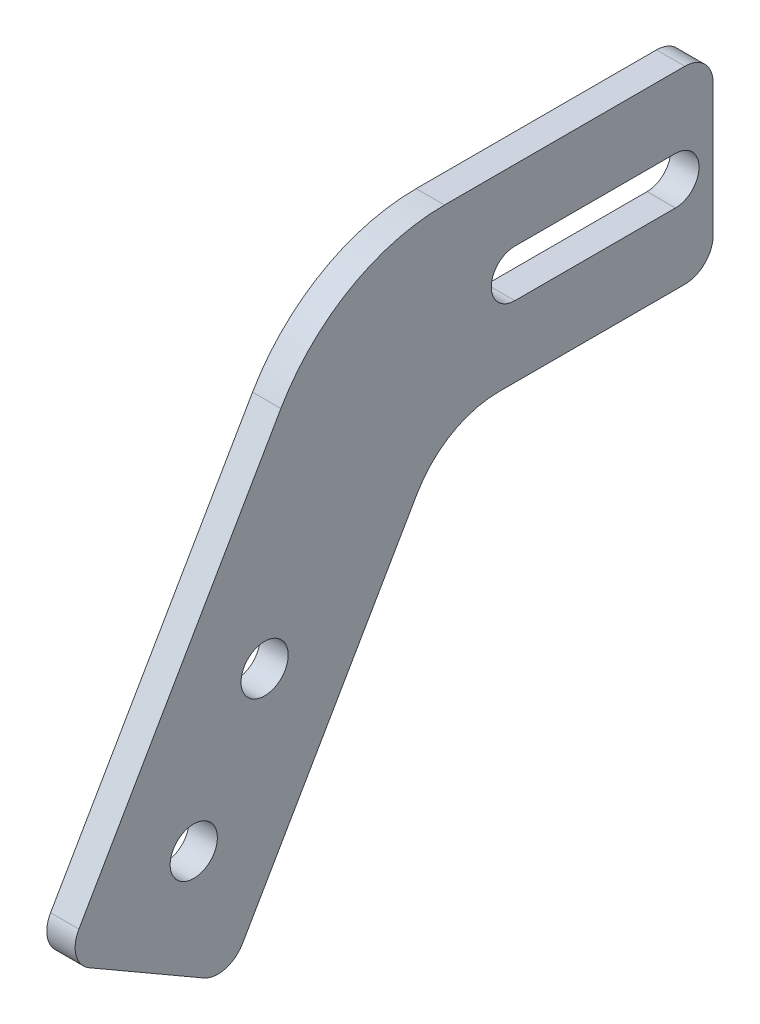
ISO-10303-21;
HEADER;
FILE_DESCRIPTION(('STEP AP214'),'2;1');
FILE_NAME('part.step','',(''),(''),'','','');
FILE_SCHEMA(('AUTOMOTIVE_DESIGN { 1 0 10303 214 1 1 1 1 }'));
ENDSEC;
DATA;
#1=APPLICATION_CONTEXT('core data for automotive mechanical design processes');
#2=APPLICATION_PROTOCOL_DEFINITION('international standard','automotive_design',2000,#1);
#3=PRODUCT_CONTEXT('',#1,'mechanical');
#4=PRODUCT('Part','Part','',(#3));
#5=PRODUCT_RELATED_PRODUCT_CATEGORY('part','',(#4));
#6=PRODUCT_DEFINITION_FORMATION('','',#4);
#7=PRODUCT_DEFINITION_CONTEXT('part definition',#1,'design');
#8=PRODUCT_DEFINITION('design','',#6,#7);
#9=PRODUCT_DEFINITION_SHAPE('','',#8);
#10=(LENGTH_UNIT() NAMED_UNIT(*) SI_UNIT(.MILLI.,.METRE.));
#11=(NAMED_UNIT(*) PLANE_ANGLE_UNIT() SI_UNIT($,.RADIAN.));
#12=(NAMED_UNIT(*) SI_UNIT($,.STERADIAN.) SOLID_ANGLE_UNIT());
#13=UNCERTAINTY_MEASURE_WITH_UNIT(LENGTH_MEASURE(1.E-05),#10,'distance_accuracy_value','');
#14=(GEOMETRIC_REPRESENTATION_CONTEXT(3) GLOBAL_UNCERTAINTY_ASSIGNED_CONTEXT((#13)) GLOBAL_UNIT_ASSIGNED_CONTEXT((#10,
#11,#12)) REPRESENTATION_CONTEXT('',''));
#15=CARTESIAN_POINT('',(0.,0.,0.));
#16=DIRECTION('',(0.,0.,1.));
#17=DIRECTION('',(1.,0.,0.));
#18=AXIS2_PLACEMENT_3D('',#15,#16,#17);
#19=CARTESIAN_POINT('',(3.,0.,-11.5470053837925));
#20=DIRECTION('',(-1.,0.,0.));
#21=DIRECTION('',(0.,0.,1.));
#22=AXIS2_PLACEMENT_3D('',#19,#20,#21);
#23=PLANE('',#22);
#24=CARTESIAN_POINT('',(3.,-12.9903810567665,7.50000000000006));
#25=DIRECTION('',(1.,0.,0.));
#26=DIRECTION('',(0.,0.,-1.));
#27=AXIS2_PLACEMENT_3D('',#24,#25,#26);
#28=CIRCLE('',#27,2.5);
#29=CARTESIAN_POINT('',(3.,-12.9903810567665,5.00000000000006));
#30=VERTEX_POINT('',#29);
#31=EDGE_CURVE('E209',#30,#30,#28,.T.);
#32=ORIENTED_EDGE('',*,*,#31,.F.);
#33=EDGE_LOOP('',(#32));
#34=FACE_BOUND('',#33,.T.);
#35=CARTESIAN_POINT('',(3.,-25.9807621135331,15.0000000000001));
#36=DIRECTION('',(1.,0.,0.));
#37=DIRECTION('',(0.,0.,-1.));
#38=AXIS2_PLACEMENT_3D('',#35,#36,#37);
#39=CIRCLE('',#38,2.5);
#40=CARTESIAN_POINT('',(3.,-25.9807621135331,12.5000000000001));
#41=VERTEX_POINT('',#40);
#42=EDGE_CURVE('E217',#41,#41,#39,.T.);
#43=ORIENTED_EDGE('',*,*,#42,.F.);
#44=EDGE_LOOP('',(#43));
#45=FACE_BOUND('',#44,.T.);
#46=DIRECTION('',(0.,-0.866025403784436,0.500000000000004));
#47=VECTOR('',#46,1.);
#48=CARTESIAN_POINT('',(3.,10.,5.77350269189623));
#49=LINE('',#48,#47);
#50=CARTESIAN_POINT('',(3.,10.,5.77350269189623));
#51=VERTEX_POINT('',#50);
#52=CARTESIAN_POINT('',(3.,-27.0429399400241,27.1602540378445));
#53=VERTEX_POINT('',#52);
#54=EDGE_CURVE('E236',#51,#53,#49,.T.);
#55=ORIENTED_EDGE('',*,*,#54,.T.);
#56=CARTESIAN_POINT('',(3.,-28.5429399400241,24.5621778264912));
#57=DIRECTION('',(-1.,0.,0.));
#58=DIRECTION('',(0.,0.,1.));
#59=AXIS2_PLACEMENT_3D('',#56,#57,#58);
#60=CIRCLE('',#59,3.);
#61=CARTESIAN_POINT('',(3.,-31.1410161513774,26.0621778264912));
#62=VERTEX_POINT('',#61);
#63=EDGE_CURVE('E323',#53,#62,#60,.F.);
#64=ORIENTED_EDGE('',*,*,#63,.T.);
#65=DIRECTION('',(0.,-0.500000000000004,-0.866025403784436));
#66=VECTOR('',#65,1.);
#67=CARTESIAN_POINT('',(3.,-29.6410161513774,28.6602540378445));
#68=LINE('',#67,#66);
#69=CARTESIAN_POINT('',(3.,-38.1410161513775,13.9378221735091));
#70=VERTEX_POINT('',#69);
#71=EDGE_CURVE('E240',#62,#70,#68,.T.);
#72=ORIENTED_EDGE('',*,*,#71,.T.);
#73=CARTESIAN_POINT('',(3.,-35.5429399400242,12.4378221735091));
#74=DIRECTION('',(-1.,0.,0.));
#75=DIRECTION('',(0.,0.,1.));
#76=AXIS2_PLACEMENT_3D('',#73,#74,#75);
#77=CIRCLE('',#76,3.);
#78=CARTESIAN_POINT('',(3.,-37.0429399400242,9.83974596215579));
#79=VERTEX_POINT('',#78);
#80=EDGE_CURVE('E62',#70,#79,#77,.F.);
#81=ORIENTED_EDGE('',*,*,#80,.T.);
#82=DIRECTION('',(0.,0.866025403784436,-0.500000000000004));
#83=VECTOR('',#82,1.);
#84=CARTESIAN_POINT('',(3.,-5.,-8.66025403784439));
#85=LINE('',#84,#83);
#86=CARTESIAN_POINT('',(3.,-5.,-8.66025403784439));
#87=VERTEX_POINT('',#86);
#88=EDGE_CURVE('E243',#79,#87,#85,.T.);
#89=ORIENTED_EDGE('',*,*,#88,.T.);
#90=CARTESIAN_POINT('',(3.,-10.,-17.3205080756888));
#91=DIRECTION('',(-1.,0.,0.));
#92=DIRECTION('',(0.,0.,1.));
#93=AXIS2_PLACEMENT_3D('',#90,#91,#92);
#94=CIRCLE('',#93,10.);
#95=CARTESIAN_POINT('',(3.,0.,-17.3205080756888));
#96=VERTEX_POINT('',#95);
#97=EDGE_CURVE('E246',#87,#96,#94,.T.);
#98=ORIENTED_EDGE('',*,*,#97,.T.);
#99=DIRECTION('',(0.,0.,-1.));
#100=VECTOR('',#99,1.);
#101=CARTESIAN_POINT('',(3.,0.,-17.3205080756888));
#102=LINE('',#101,#100);
#103=CARTESIAN_POINT('',(3.,0.,-37.0000000000001));
#104=VERTEX_POINT('',#103);
#105=EDGE_CURVE('E249',#96,#104,#102,.T.);
#106=ORIENTED_EDGE('',*,*,#105,.T.);
#107=CARTESIAN_POINT('',(3.,3.,-37.0000000000001));
#108=DIRECTION('',(-1.,0.,0.));
#109=DIRECTION('',(0.,0.,1.));
#110=AXIS2_PLACEMENT_3D('',#107,#108,#109);
#111=CIRCLE('',#110,3.);
#112=CARTESIAN_POINT('',(3.,3.,-40.0000000000001));
#113=VERTEX_POINT('',#112);
#114=EDGE_CURVE('E318',#104,#113,#111,.F.);
#115=ORIENTED_EDGE('',*,*,#114,.T.);
#116=DIRECTION('',(0.,1.,0.));
#117=VECTOR('',#116,1.);
#118=CARTESIAN_POINT('',(3.,0.,-40.0000000000001));
#119=LINE('',#118,#117);
#120=CARTESIAN_POINT('',(3.,17.,-40.0000000000001));
#121=VERTEX_POINT('',#120);
#122=EDGE_CURVE('E225',#113,#121,#119,.T.);
#123=ORIENTED_EDGE('',*,*,#122,.T.);
#124=CARTESIAN_POINT('',(3.,17.,-37.0000000000001));
#125=DIRECTION('',(-1.,0.,0.));
#126=DIRECTION('',(0.,0.,1.));
#127=AXIS2_PLACEMENT_3D('',#124,#125,#126);
#128=CIRCLE('',#127,3.);
#129=CARTESIAN_POINT('',(3.,20.,-37.0000000000001));
#130=VERTEX_POINT('',#129);
#131=EDGE_CURVE('E315',#121,#130,#128,.F.);
#132=ORIENTED_EDGE('',*,*,#131,.T.);
#133=DIRECTION('',(0.,0.,1.));
#134=VECTOR('',#133,1.);
#135=CARTESIAN_POINT('',(3.,20.,-40.0000000000001));
#136=LINE('',#135,#134);
#137=CARTESIAN_POINT('',(3.,20.,-11.5470053837926));
#138=VERTEX_POINT('',#137);
#139=EDGE_CURVE('E229',#130,#138,#136,.T.);
#140=ORIENTED_EDGE('',*,*,#139,.T.);
#141=CARTESIAN_POINT('',(3.,0.,-11.5470053837925));
#142=DIRECTION('',(1.,0.,0.));
#143=DIRECTION('',(0.,0.,1.));
#144=AXIS2_PLACEMENT_3D('',#141,#142,#143);
#145=CIRCLE('',#144,20.);
#146=EDGE_CURVE('E233',#138,#51,#145,.T.);
#147=ORIENTED_EDGE('',*,*,#146,.T.);
#148=EDGE_LOOP('',(#55,#64,#72,#81,#89,#98,#106,#115,#123,#132,#140,#147));
#149=FACE_BOUND('',#148,.T.);
#150=CARTESIAN_POINT('',(3.,10.,-19.0000000000001));
#151=DIRECTION('',(1.,0.,0.));
#152=DIRECTION('',(0.,0.,-1.));
#153=AXIS2_PLACEMENT_3D('',#150,#151,#152);
#154=CIRCLE('',#153,2.5);
#155=CARTESIAN_POINT('',(3.,12.5,-19.0000000000001));
#156=VERTEX_POINT('',#155);
#157=CARTESIAN_POINT('',(3.,7.5,-19.0000000000001));
#158=VERTEX_POINT('',#157);
#159=EDGE_CURVE('E156',#156,#158,#154,.T.);
#160=ORIENTED_EDGE('',*,*,#159,.F.);
#161=DIRECTION('',(0.,0.,1.));
#162=VECTOR('',#161,1.);
#163=CARTESIAN_POINT('',(3.,12.5,-19.0000000000001));
#164=LINE('',#163,#162);
#165=CARTESIAN_POINT('',(3.,12.5,-36.0000000000001));
#166=VERTEX_POINT('',#165);
#167=EDGE_CURVE('E185',#166,#156,#164,.T.);
#168=ORIENTED_EDGE('',*,*,#167,.F.);
#169=CARTESIAN_POINT('',(3.,10.,-36.0000000000001));
#170=DIRECTION('',(1.,0.,0.));
#171=DIRECTION('',(0.,0.,-1.));
#172=AXIS2_PLACEMENT_3D('',#169,#170,#171);
#173=CIRCLE('',#172,2.5);
#174=CARTESIAN_POINT('',(3.,7.5,-36.0000000000001));
#175=VERTEX_POINT('',#174);
#176=EDGE_CURVE('E181',#175,#166,#173,.T.);
#177=ORIENTED_EDGE('',*,*,#176,.F.);
#178=DIRECTION('',(0.,0.,-1.));
#179=VECTOR('',#178,1.);
#180=CARTESIAN_POINT('',(3.,7.5,-36.0000000000001));
#181=LINE('',#180,#179);
#182=EDGE_CURVE('E167',#158,#175,#181,.T.);
#183=ORIENTED_EDGE('',*,*,#182,.F.);
#184=EDGE_LOOP('',(#160,#168,#177,#183));
#185=FACE_BOUND('',#184,.T.);
#186=ADVANCED_FACE('F39',(#34,#45,#149,#185),#23,.F.);
#187=CARTESIAN_POINT('',(0.,0.,-11.5470053837925));
#188=DIRECTION('',(-1.,0.,0.));
#189=DIRECTION('',(0.,0.,1.));
#190=AXIS2_PLACEMENT_3D('',#187,#188,#189);
#191=PLANE('',#190);
#192=CARTESIAN_POINT('',(0.,-25.9807621135331,15.0000000000001));
#193=DIRECTION('',(1.,0.,0.));
#194=DIRECTION('',(0.,0.,-1.));
#195=AXIS2_PLACEMENT_3D('',#192,#193,#194);
#196=CIRCLE('',#195,2.5);
#197=CARTESIAN_POINT('',(0.,-25.9807621135331,12.5000000000001));
#198=VERTEX_POINT('',#197);
#199=EDGE_CURVE('E213',#198,#198,#196,.T.);
#200=ORIENTED_EDGE('',*,*,#199,.T.);
#201=EDGE_LOOP('',(#200));
#202=FACE_BOUND('',#201,.T.);
#203=DIRECTION('',(0.,-0.500000000000004,-0.866025403784436));
#204=VECTOR('',#203,1.);
#205=CARTESIAN_POINT('',(0.,-29.6410161513774,28.6602540378445));
#206=LINE('',#205,#204);
#207=CARTESIAN_POINT('',(0.,-31.1410161513774,26.0621778264912));
#208=VERTEX_POINT('',#207);
#209=CARTESIAN_POINT('',(0.,-38.1410161513775,13.9378221735091));
#210=VERTEX_POINT('',#209);
#211=EDGE_CURVE('E266',#208,#210,#206,.T.);
#212=ORIENTED_EDGE('',*,*,#211,.F.);
#213=CARTESIAN_POINT('',(0.,-28.5429399400241,24.5621778264912));
#214=DIRECTION('',(-1.,0.,0.));
#215=DIRECTION('',(0.,0.,1.));
#216=AXIS2_PLACEMENT_3D('',#213,#214,#215);
#217=CIRCLE('',#216,3.);
#218=CARTESIAN_POINT('',(0.,-27.0429399400241,27.1602540378445));
#219=VERTEX_POINT('',#218);
#220=EDGE_CURVE('E309',#208,#219,#217,.T.);
#221=ORIENTED_EDGE('',*,*,#220,.T.);
#222=DIRECTION('',(0.,-0.866025403784436,0.500000000000004));
#223=VECTOR('',#222,1.);
#224=CARTESIAN_POINT('',(0.,10.,5.77350269189623));
#225=LINE('',#224,#223);
#226=CARTESIAN_POINT('',(0.,10.,5.77350269189623));
#227=VERTEX_POINT('',#226);
#228=EDGE_CURVE('E262',#227,#219,#225,.T.);
#229=ORIENTED_EDGE('',*,*,#228,.F.);
#230=CARTESIAN_POINT('',(0.,0.,-11.5470053837925));
#231=DIRECTION('',(1.,0.,0.));
#232=DIRECTION('',(0.,0.,1.));
#233=AXIS2_PLACEMENT_3D('',#230,#231,#232);
#234=CIRCLE('',#233,20.);
#235=CARTESIAN_POINT('',(0.,20.,-11.5470053837926));
#236=VERTEX_POINT('',#235);
#237=EDGE_CURVE('E259',#236,#227,#234,.T.);
#238=ORIENTED_EDGE('',*,*,#237,.F.);
#239=DIRECTION('',(0.,0.,1.));
#240=VECTOR('',#239,1.);
#241=CARTESIAN_POINT('',(0.,20.,-40.0000000000001));
#242=LINE('',#241,#240);
#243=CARTESIAN_POINT('',(0.,20.,-37.0000000000001));
#244=VERTEX_POINT('',#243);
#245=EDGE_CURVE('E256',#244,#236,#242,.T.);
#246=ORIENTED_EDGE('',*,*,#245,.F.);
#247=CARTESIAN_POINT('',(0.,17.,-37.0000000000001));
#248=DIRECTION('',(-1.,0.,0.));
#249=DIRECTION('',(0.,0.,1.));
#250=AXIS2_PLACEMENT_3D('',#247,#248,#249);
#251=CIRCLE('',#250,3.);
#252=CARTESIAN_POINT('',(0.,17.,-40.0000000000001));
#253=VERTEX_POINT('',#252);
#254=EDGE_CURVE('E300',#244,#253,#251,.T.);
#255=ORIENTED_EDGE('',*,*,#254,.T.);
#256=DIRECTION('',(0.,1.,0.));
#257=VECTOR('',#256,1.);
#258=CARTESIAN_POINT('',(0.,0.,-40.0000000000001));
#259=LINE('',#258,#257);
#260=CARTESIAN_POINT('',(0.,3.,-40.0000000000001));
#261=VERTEX_POINT('',#260);
#262=EDGE_CURVE('E221',#261,#253,#259,.T.);
#263=ORIENTED_EDGE('',*,*,#262,.F.);
#264=CARTESIAN_POINT('',(0.,3.,-37.0000000000001));
#265=DIRECTION('',(-1.,0.,0.));
#266=DIRECTION('',(0.,0.,1.));
#267=AXIS2_PLACEMENT_3D('',#264,#265,#266);
#268=CIRCLE('',#267,3.);
#269=CARTESIAN_POINT('',(0.,0.,-37.0000000000001));
#270=VERTEX_POINT('',#269);
#271=EDGE_CURVE('E303',#261,#270,#268,.T.);
#272=ORIENTED_EDGE('',*,*,#271,.T.);
#273=DIRECTION('',(0.,0.,-1.));
#274=VECTOR('',#273,1.);
#275=CARTESIAN_POINT('',(0.,0.,-17.3205080756888));
#276=LINE('',#275,#274);
#277=CARTESIAN_POINT('',(0.,0.,-17.3205080756888));
#278=VERTEX_POINT('',#277);
#279=EDGE_CURVE('E230',#278,#270,#276,.T.);
#280=ORIENTED_EDGE('',*,*,#279,.F.);
#281=CARTESIAN_POINT('',(0.,-10.,-17.3205080756888));
#282=DIRECTION('',(-1.,0.,0.));
#283=DIRECTION('',(0.,0.,1.));
#284=AXIS2_PLACEMENT_3D('',#281,#282,#283);
#285=CIRCLE('',#284,10.);
#286=CARTESIAN_POINT('',(0.,-5.,-8.66025403784439));
#287=VERTEX_POINT('',#286);
#288=EDGE_CURVE('E273',#287,#278,#285,.T.);
#289=ORIENTED_EDGE('',*,*,#288,.F.);
#290=DIRECTION('',(0.,0.866025403784436,-0.500000000000004));
#291=VECTOR('',#290,1.);
#292=CARTESIAN_POINT('',(0.,-5.,-8.66025403784439));
#293=LINE('',#292,#291);
#294=CARTESIAN_POINT('',(0.,-37.0429399400242,9.83974596215579));
#295=VERTEX_POINT('',#294);
#296=EDGE_CURVE('E270',#295,#287,#293,.T.);
#297=ORIENTED_EDGE('',*,*,#296,.F.);
#298=CARTESIAN_POINT('',(0.,-35.5429399400242,12.4378221735091));
#299=DIRECTION('',(-1.,0.,0.));
#300=DIRECTION('',(0.,0.,1.));
#301=AXIS2_PLACEMENT_3D('',#298,#299,#300);
#302=CIRCLE('',#301,3.);
#303=EDGE_CURVE('E306',#295,#210,#302,.T.);
#304=ORIENTED_EDGE('',*,*,#303,.T.);
#305=EDGE_LOOP('',(#212,#221,#229,#238,#246,#255,#263,#272,#280,#289,#297,#304));
#306=FACE_BOUND('',#305,.T.);
#307=CARTESIAN_POINT('',(0.,-12.9903810567665,7.50000000000006));
#308=DIRECTION('',(1.,0.,0.));
#309=DIRECTION('',(0.,0.,-1.));
#310=AXIS2_PLACEMENT_3D('',#307,#308,#309);
#311=CIRCLE('',#310,2.5);
#312=CARTESIAN_POINT('',(0.,-12.9903810567665,5.00000000000006));
#313=VERTEX_POINT('',#312);
#314=EDGE_CURVE('E176',#313,#313,#311,.T.);
#315=ORIENTED_EDGE('',*,*,#314,.T.);
#316=EDGE_LOOP('',(#315));
#317=FACE_BOUND('',#316,.T.);
#318=DIRECTION('',(0.,0.,1.));
#319=VECTOR('',#318,1.);
#320=CARTESIAN_POINT('',(0.,12.5,-19.0000000000001));
#321=LINE('',#320,#319);
#322=CARTESIAN_POINT('',(0.,12.5,-36.0000000000001));
#323=VERTEX_POINT('',#322);
#324=CARTESIAN_POINT('',(0.,12.5,-19.0000000000001));
#325=VERTEX_POINT('',#324);
#326=EDGE_CURVE('E168',#323,#325,#321,.T.);
#327=ORIENTED_EDGE('',*,*,#326,.T.);
#328=CARTESIAN_POINT('',(0.,10.,-19.0000000000001));
#329=DIRECTION('',(1.,0.,0.));
#330=DIRECTION('',(0.,0.,-1.));
#331=AXIS2_PLACEMENT_3D('',#328,#329,#330);
#332=CIRCLE('',#331,2.5);
#333=CARTESIAN_POINT('',(0.,7.5,-19.0000000000001));
#334=VERTEX_POINT('',#333);
#335=EDGE_CURVE('E190',#325,#334,#332,.T.);
#336=ORIENTED_EDGE('',*,*,#335,.T.);
#337=DIRECTION('',(0.,0.,-1.));
#338=VECTOR('',#337,1.);
#339=CARTESIAN_POINT('',(0.,7.5,-36.0000000000001));
#340=LINE('',#339,#338);
#341=CARTESIAN_POINT('',(0.,7.5,-36.0000000000001));
#342=VERTEX_POINT('',#341);
#343=EDGE_CURVE('E174',#334,#342,#340,.T.);
#344=ORIENTED_EDGE('',*,*,#343,.T.);
#345=CARTESIAN_POINT('',(0.,10.,-36.0000000000001));
#346=DIRECTION('',(1.,0.,0.));
#347=DIRECTION('',(0.,0.,-1.));
#348=AXIS2_PLACEMENT_3D('',#345,#346,#347);
#349=CIRCLE('',#348,2.5);
#350=EDGE_CURVE('E195',#342,#323,#349,.T.);
#351=ORIENTED_EDGE('',*,*,#350,.T.);
#352=EDGE_LOOP('',(#327,#336,#344,#351));
#353=FACE_BOUND('',#352,.T.);
#354=ADVANCED_FACE('F347',(#202,#306,#317,#353),#191,.T.);
#355=CARTESIAN_POINT('',(3.,0.,-40.0000000000001));
#356=DIRECTION('',(0.,0.,1.));
#357=DIRECTION('',(1.,0.,0.));
#358=AXIS2_PLACEMENT_3D('',#355,#356,#357);
#359=PLANE('',#358);
#360=ORIENTED_EDGE('',*,*,#122,.F.);
#361=DIRECTION('',(-1.,0.,0.));
#362=VECTOR('',#361,1.);
#363=CARTESIAN_POINT('',(3.,3.,-40.0000000000001));
#364=LINE('',#363,#362);
#365=EDGE_CURVE('E333',#113,#261,#364,.T.);
#366=ORIENTED_EDGE('',*,*,#365,.T.);
#367=ORIENTED_EDGE('',*,*,#262,.T.);
#368=DIRECTION('',(-1.,0.,0.));
#369=VECTOR('',#368,1.);
#370=CARTESIAN_POINT('',(3.,17.,-40.0000000000001));
#371=LINE('',#370,#369);
#372=EDGE_CURVE('E330',#253,#121,#371,.F.);
#373=ORIENTED_EDGE('',*,*,#372,.T.);
#374=EDGE_LOOP('',(#360,#366,#367,#373));
#375=FACE_BOUND('',#374,.T.);
#376=ADVANCED_FACE('F341',(#375),#359,.F.);
#377=CARTESIAN_POINT('',(3.,20.,-40.0000000000001));
#378=DIRECTION('',(0.,-1.,0.));
#379=DIRECTION('',(0.,0.,-1.));
#380=AXIS2_PLACEMENT_3D('',#377,#378,#379);
#381=PLANE('',#380);
#382=ORIENTED_EDGE('',*,*,#139,.F.);
#383=DIRECTION('',(-1.,0.,0.));
#384=VECTOR('',#383,1.);
#385=CARTESIAN_POINT('',(3.,20.,-37.0000000000001));
#386=LINE('',#385,#384);
#387=EDGE_CURVE('E11',#130,#244,#386,.T.);
#388=ORIENTED_EDGE('',*,*,#387,.T.);
#389=ORIENTED_EDGE('',*,*,#245,.T.);
#390=DIRECTION('',(-1.,0.,0.));
#391=VECTOR('',#390,1.);
#392=CARTESIAN_POINT('',(3.,20.,-11.5470053837926));
#393=LINE('',#392,#391);
#394=EDGE_CURVE('E289',#138,#236,#393,.T.);
#395=ORIENTED_EDGE('',*,*,#394,.F.);
#396=EDGE_LOOP('',(#382,#388,#389,#395));
#397=FACE_BOUND('',#396,.T.);
#398=ADVANCED_FACE('F357',(#397),#381,.F.);
#399=CARTESIAN_POINT('',(3.,0.,-11.5470053837925));
#400=DIRECTION('',(-1.,0.,0.));
#401=DIRECTION('',(0.,0.,1.));
#402=AXIS2_PLACEMENT_3D('',#399,#400,#401);
#403=CYLINDRICAL_SURFACE('',#402,20.);
#404=ORIENTED_EDGE('',*,*,#237,.T.);
#405=DIRECTION('',(-1.,0.,0.));
#406=VECTOR('',#405,1.);
#407=CARTESIAN_POINT('',(3.,10.,5.77350269189623));
#408=LINE('',#407,#406);
#409=EDGE_CURVE('E285',#51,#227,#408,.T.);
#410=ORIENTED_EDGE('',*,*,#409,.F.);
#411=ORIENTED_EDGE('',*,*,#146,.F.);
#412=ORIENTED_EDGE('',*,*,#394,.T.);
#413=EDGE_LOOP('',(#404,#410,#411,#412));
#414=FACE_BOUND('',#413,.T.);
#415=ADVANCED_FACE('F403',(#414),#403,.T.);
#416=CARTESIAN_POINT('',(3.,10.,5.77350269189623));
#417=DIRECTION('',(0.,-0.500000000000004,-0.866025403784436));
#418=DIRECTION('',(0.,0.866025403784436,-0.500000000000004));
#419=AXIS2_PLACEMENT_3D('',#416,#417,#418);
#420=PLANE('',#419);
#421=ORIENTED_EDGE('',*,*,#228,.T.);
#422=DIRECTION('',(-1.,0.,0.));
#423=VECTOR('',#422,1.);
#424=CARTESIAN_POINT('',(3.,-27.0429399400241,27.1602540378445));
#425=LINE('',#424,#423);
#426=EDGE_CURVE('E312',#219,#53,#425,.F.);
#427=ORIENTED_EDGE('',*,*,#426,.T.);
#428=ORIENTED_EDGE('',*,*,#54,.F.);
#429=ORIENTED_EDGE('',*,*,#409,.T.);
#430=EDGE_LOOP('',(#421,#427,#428,#429));
#431=FACE_BOUND('',#430,.T.);
#432=ADVANCED_FACE('F399',(#431),#420,.F.);
#433=CARTESIAN_POINT('',(3.,-29.6410161513774,28.6602540378445));
#434=DIRECTION('',(0.,0.866025403784436,-0.500000000000004));
#435=DIRECTION('',(0.,0.500000000000004,0.866025403784436));
#436=AXIS2_PLACEMENT_3D('',#433,#434,#435);
#437=PLANE('',#436);
#438=ORIENTED_EDGE('',*,*,#71,.F.);
#439=DIRECTION('',(-1.,0.,0.));
#440=VECTOR('',#439,1.);
#441=CARTESIAN_POINT('',(3.,-31.1410161513774,26.0621778264912));
#442=LINE('',#441,#440);
#443=EDGE_CURVE('E296',#62,#208,#442,.T.);
#444=ORIENTED_EDGE('',*,*,#443,.T.);
#445=ORIENTED_EDGE('',*,*,#211,.T.);
#446=DIRECTION('',(-1.,0.,0.));
#447=VECTOR('',#446,1.);
#448=CARTESIAN_POINT('',(3.,-38.1410161513775,13.9378221735091));
#449=LINE('',#448,#447);
#450=EDGE_CURVE('E293',#210,#70,#449,.F.);
#451=ORIENTED_EDGE('',*,*,#450,.T.);
#452=EDGE_LOOP('',(#438,#444,#445,#451));
#453=FACE_BOUND('',#452,.T.);
#454=ADVANCED_FACE('F395',(#453),#437,.F.);
#455=CARTESIAN_POINT('',(3.,-5.,-8.66025403784439));
#456=DIRECTION('',(0.,0.500000000000004,0.866025403784436));
#457=DIRECTION('',(0.,-0.866025403784436,0.500000000000004));
#458=AXIS2_PLACEMENT_3D('',#455,#456,#457);
#459=PLANE('',#458);
#460=ORIENTED_EDGE('',*,*,#88,.F.);
#461=DIRECTION('',(-1.,0.,0.));
#462=VECTOR('',#461,1.);
#463=CARTESIAN_POINT('',(3.,-37.0429399400242,9.83974596215579));
#464=LINE('',#463,#462);
#465=EDGE_CURVE('E326',#79,#295,#464,.T.);
#466=ORIENTED_EDGE('',*,*,#465,.T.);
#467=ORIENTED_EDGE('',*,*,#296,.T.);
#468=DIRECTION('',(-1.,0.,0.));
#469=VECTOR('',#468,1.);
#470=CARTESIAN_POINT('',(3.,-5.,-8.66025403784439));
#471=LINE('',#470,#469);
#472=EDGE_CURVE('E281',#87,#287,#471,.T.);
#473=ORIENTED_EDGE('',*,*,#472,.F.);
#474=EDGE_LOOP('',(#460,#466,#467,#473));
#475=FACE_BOUND('',#474,.T.);
#476=ADVANCED_FACE('F391',(#475),#459,.F.);
#477=CARTESIAN_POINT('',(3.,-10.,-17.3205080756888));
#478=DIRECTION('',(-1.,0.,0.));
#479=DIRECTION('',(0.,0.,1.));
#480=AXIS2_PLACEMENT_3D('',#477,#478,#479);
#481=CYLINDRICAL_SURFACE('',#480,10.);
#482=ORIENTED_EDGE('',*,*,#288,.T.);
#483=DIRECTION('',(-1.,0.,0.));
#484=VECTOR('',#483,1.);
#485=CARTESIAN_POINT('',(3.,0.,-17.3205080756888));
#486=LINE('',#485,#484);
#487=EDGE_CURVE('E252',#96,#278,#486,.T.);
#488=ORIENTED_EDGE('',*,*,#487,.F.);
#489=ORIENTED_EDGE('',*,*,#97,.F.);
#490=ORIENTED_EDGE('',*,*,#472,.T.);
#491=EDGE_LOOP('',(#482,#488,#489,#490));
#492=FACE_BOUND('',#491,.T.);
#493=ADVANCED_FACE('F388',(#492),#481,.F.);
#494=CARTESIAN_POINT('',(3.,0.,-17.3205080756888));
#495=DIRECTION('',(0.,1.,0.));
#496=DIRECTION('',(0.,0.,1.));
#497=AXIS2_PLACEMENT_3D('',#494,#495,#496);
#498=PLANE('',#497);
#499=ORIENTED_EDGE('',*,*,#279,.T.);
#500=DIRECTION('',(-1.,0.,0.));
#501=VECTOR('',#500,1.);
#502=CARTESIAN_POINT('',(3.,0.,-37.0000000000001));
#503=LINE('',#502,#501);
#504=EDGE_CURVE('E48',#270,#104,#503,.F.);
#505=ORIENTED_EDGE('',*,*,#504,.T.);
#506=ORIENTED_EDGE('',*,*,#105,.F.);
#507=ORIENTED_EDGE('',*,*,#487,.T.);
#508=EDGE_LOOP('',(#499,#505,#506,#507));
#509=FACE_BOUND('',#508,.T.);
#510=ADVANCED_FACE('F385',(#509),#498,.F.);
#511=CARTESIAN_POINT('',(3.,-25.9807621135331,15.0000000000001));
#512=DIRECTION('',(-1.,0.,0.));
#513=DIRECTION('',(0.,0.,1.));
#514=AXIS2_PLACEMENT_3D('',#511,#512,#513);
#515=CYLINDRICAL_SURFACE('',#514,2.5);
#516=ORIENTED_EDGE('',*,*,#42,.T.);
#517=EDGE_LOOP('',(#516));
#518=FACE_BOUND('',#517,.T.);
#519=ORIENTED_EDGE('',*,*,#199,.F.);
#520=EDGE_LOOP('',(#519));
#521=FACE_BOUND('',#520,.T.);
#522=ADVANCED_FACE('F382',(#518,#521),#515,.F.);
#523=CARTESIAN_POINT('',(3.,-12.9903810567665,7.50000000000006));
#524=DIRECTION('',(-1.,0.,0.));
#525=DIRECTION('',(0.,0.,1.));
#526=AXIS2_PLACEMENT_3D('',#523,#524,#525);
#527=CYLINDRICAL_SURFACE('',#526,2.5);
#528=ORIENTED_EDGE('',*,*,#31,.T.);
#529=EDGE_LOOP('',(#528));
#530=FACE_BOUND('',#529,.T.);
#531=ORIENTED_EDGE('',*,*,#314,.F.);
#532=EDGE_LOOP('',(#531));
#533=FACE_BOUND('',#532,.T.);
#534=ADVANCED_FACE('F444',(#530,#533),#527,.F.);
#535=CARTESIAN_POINT('',(3.,10.,-19.0000000000001));
#536=DIRECTION('',(-1.,0.,0.));
#537=DIRECTION('',(0.,0.,1.));
#538=AXIS2_PLACEMENT_3D('',#535,#536,#537);
#539=CYLINDRICAL_SURFACE('',#538,2.5);
#540=ORIENTED_EDGE('',*,*,#335,.F.);
#541=DIRECTION('',(-1.,0.,0.));
#542=VECTOR('',#541,1.);
#543=CARTESIAN_POINT('',(3.,12.5,-19.0000000000001));
#544=LINE('',#543,#542);
#545=EDGE_CURVE('E162',#156,#325,#544,.T.);
#546=ORIENTED_EDGE('',*,*,#545,.F.);
#547=ORIENTED_EDGE('',*,*,#159,.T.);
#548=DIRECTION('',(-1.,0.,0.));
#549=VECTOR('',#548,1.);
#550=CARTESIAN_POINT('',(3.,7.5,-19.0000000000001));
#551=LINE('',#550,#549);
#552=EDGE_CURVE('E159',#158,#334,#551,.T.);
#553=ORIENTED_EDGE('',*,*,#552,.T.);
#554=EDGE_LOOP('',(#540,#546,#547,#553));
#555=FACE_BOUND('',#554,.T.);
#556=ADVANCED_FACE('F158',(#555),#539,.F.);
#557=CARTESIAN_POINT('',(3.,7.5,-36.0000000000001));
#558=DIRECTION('',(0.,1.,0.));
#559=DIRECTION('',(0.,0.,1.));
#560=AXIS2_PLACEMENT_3D('',#557,#558,#559);
#561=PLANE('',#560);
#562=ORIENTED_EDGE('',*,*,#343,.F.);
#563=ORIENTED_EDGE('',*,*,#552,.F.);
#564=ORIENTED_EDGE('',*,*,#182,.T.);
#565=DIRECTION('',(-1.,0.,0.));
#566=VECTOR('',#565,1.);
#567=CARTESIAN_POINT('',(3.,7.5,-36.0000000000001));
#568=LINE('',#567,#566);
#569=EDGE_CURVE('E177',#175,#342,#568,.T.);
#570=ORIENTED_EDGE('',*,*,#569,.T.);
#571=EDGE_LOOP('',(#562,#563,#564,#570));
#572=FACE_BOUND('',#571,.T.);
#573=ADVANCED_FACE('F171',(#572),#561,.T.);
#574=CARTESIAN_POINT('',(3.,10.,-36.0000000000001));
#575=DIRECTION('',(-1.,0.,0.));
#576=DIRECTION('',(0.,0.,1.));
#577=AXIS2_PLACEMENT_3D('',#574,#575,#576);
#578=CYLINDRICAL_SURFACE('',#577,2.5);
#579=ORIENTED_EDGE('',*,*,#350,.F.);
#580=ORIENTED_EDGE('',*,*,#569,.F.);
#581=ORIENTED_EDGE('',*,*,#176,.T.);
#582=DIRECTION('',(-1.,0.,0.));
#583=VECTOR('',#582,1.);
#584=CARTESIAN_POINT('',(3.,12.5,-36.0000000000001));
#585=LINE('',#584,#583);
#586=EDGE_CURVE('E204',#166,#323,#585,.T.);
#587=ORIENTED_EDGE('',*,*,#586,.T.);
#588=EDGE_LOOP('',(#579,#580,#581,#587));
#589=FACE_BOUND('',#588,.T.);
#590=ADVANCED_FACE('F418',(#589),#578,.F.);
#591=CARTESIAN_POINT('',(3.,12.5,-19.0000000000001));
#592=DIRECTION('',(0.,-1.,0.));
#593=DIRECTION('',(0.,0.,-1.));
#594=AXIS2_PLACEMENT_3D('',#591,#592,#593);
#595=PLANE('',#594);
#596=ORIENTED_EDGE('',*,*,#326,.F.);
#597=ORIENTED_EDGE('',*,*,#586,.F.);
#598=ORIENTED_EDGE('',*,*,#167,.T.);
#599=ORIENTED_EDGE('',*,*,#545,.T.);
#600=EDGE_LOOP('',(#596,#597,#598,#599));
#601=FACE_BOUND('',#600,.T.);
#602=ADVANCED_FACE('F413',(#601),#595,.T.);
#603=CARTESIAN_POINT('',(3.,-28.5429399400241,24.5621778264912));
#604=DIRECTION('',(-1.,0.,0.));
#605=DIRECTION('',(0.,0.,1.));
#606=AXIS2_PLACEMENT_3D('',#603,#604,#605);
#607=CYLINDRICAL_SURFACE('',#606,3.);
#608=ORIENTED_EDGE('',*,*,#63,.F.);
#609=ORIENTED_EDGE('',*,*,#426,.F.);
#610=ORIENTED_EDGE('',*,*,#220,.F.);
#611=ORIENTED_EDGE('',*,*,#443,.F.);
#612=EDGE_LOOP('',(#608,#609,#610,#611));
#613=FACE_BOUND('',#612,.T.);
#614=ADVANCED_FACE('F368',(#613),#607,.T.);
#615=CARTESIAN_POINT('',(3.,-35.5429399400242,12.4378221735091));
#616=DIRECTION('',(-1.,0.,0.));
#617=DIRECTION('',(0.,0.,1.));
#618=AXIS2_PLACEMENT_3D('',#615,#616,#617);
#619=CYLINDRICAL_SURFACE('',#618,3.);
#620=ORIENTED_EDGE('',*,*,#80,.F.);
#621=ORIENTED_EDGE('',*,*,#450,.F.);
#622=ORIENTED_EDGE('',*,*,#303,.F.);
#623=ORIENTED_EDGE('',*,*,#465,.F.);
#624=EDGE_LOOP('',(#620,#621,#622,#623));
#625=FACE_BOUND('',#624,.T.);
#626=ADVANCED_FACE('F363',(#625),#619,.T.);
#627=CARTESIAN_POINT('',(3.,3.,-37.0000000000001));
#628=DIRECTION('',(-1.,0.,0.));
#629=DIRECTION('',(0.,0.,1.));
#630=AXIS2_PLACEMENT_3D('',#627,#628,#629);
#631=CYLINDRICAL_SURFACE('',#630,3.);
#632=ORIENTED_EDGE('',*,*,#114,.F.);
#633=ORIENTED_EDGE('',*,*,#504,.F.);
#634=ORIENTED_EDGE('',*,*,#271,.F.);
#635=ORIENTED_EDGE('',*,*,#365,.F.);
#636=EDGE_LOOP('',(#632,#633,#634,#635));
#637=FACE_BOUND('',#636,.T.);
#638=ADVANCED_FACE('F361',(#637),#631,.T.);
#639=CARTESIAN_POINT('',(3.,17.,-37.0000000000001));
#640=DIRECTION('',(-1.,0.,0.));
#641=DIRECTION('',(0.,0.,1.));
#642=AXIS2_PLACEMENT_3D('',#639,#640,#641);
#643=CYLINDRICAL_SURFACE('',#642,3.);
#644=ORIENTED_EDGE('',*,*,#131,.F.);
#645=ORIENTED_EDGE('',*,*,#372,.F.);
#646=ORIENTED_EDGE('',*,*,#254,.F.);
#647=ORIENTED_EDGE('',*,*,#387,.F.);
#648=EDGE_LOOP('',(#644,#645,#646,#647));
#649=FACE_BOUND('',#648,.T.);
#650=ADVANCED_FACE('F41',(#649),#643,.T.);
#651=CLOSED_SHELL('',(#186,#354,#376,#398,#415,#432,#454,#476,#493,#510,#522,#534,#556,#573,
#590,#602,#614,#626,#638,#650));
#652=MANIFOLD_SOLID_BREP('B2',#651);
#653=ADVANCED_BREP_SHAPE_REPRESENTATION('',(#18,#652),#14);
#654=SHAPE_DEFINITION_REPRESENTATION(#9,#653);
ENDSEC;
END-ISO-10303-21;
